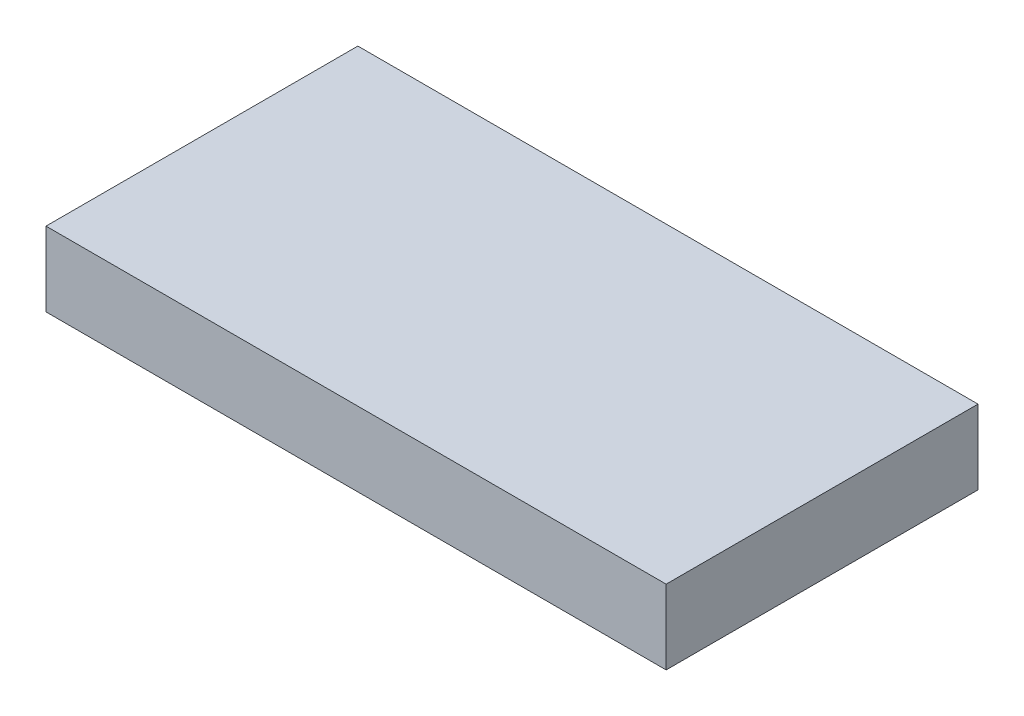
ISO-10303-21;
HEADER;
FILE_DESCRIPTION(('STEP AP214'),'2;1');
FILE_NAME('part.step','',(''),(''),'','','');
FILE_SCHEMA(('AUTOMOTIVE_DESIGN { 1 0 10303 214 1 1 1 1 }'));
ENDSEC;
DATA;
#1=APPLICATION_CONTEXT('core data for automotive mechanical design processes');
#2=APPLICATION_PROTOCOL_DEFINITION('international standard','automotive_design',2000,#1);
#3=PRODUCT_CONTEXT('',#1,'mechanical');
#4=PRODUCT('Part','Part','',(#3));
#5=PRODUCT_RELATED_PRODUCT_CATEGORY('part','',(#4));
#6=PRODUCT_DEFINITION_FORMATION('','',#4);
#7=PRODUCT_DEFINITION_CONTEXT('part definition',#1,'design');
#8=PRODUCT_DEFINITION('design','',#6,#7);
#9=PRODUCT_DEFINITION_SHAPE('','',#8);
#10=(LENGTH_UNIT() NAMED_UNIT(*) SI_UNIT(.MILLI.,.METRE.));
#11=(NAMED_UNIT(*) PLANE_ANGLE_UNIT() SI_UNIT($,.RADIAN.));
#12=(NAMED_UNIT(*) SI_UNIT($,.STERADIAN.) SOLID_ANGLE_UNIT());
#13=UNCERTAINTY_MEASURE_WITH_UNIT(LENGTH_MEASURE(1.E-05),#10,'distance_accuracy_value','');
#14=(GEOMETRIC_REPRESENTATION_CONTEXT(3) GLOBAL_UNCERTAINTY_ASSIGNED_CONTEXT((#13)) GLOBAL_UNIT_ASSIGNED_CONTEXT((#10,
#11,#12)) REPRESENTATION_CONTEXT('',''));
#15=CARTESIAN_POINT('',(0.,0.,0.));
#16=DIRECTION('',(0.,0.,1.));
#17=DIRECTION('',(1.,0.,0.));
#18=AXIS2_PLACEMENT_3D('',#15,#16,#17);
#19=CARTESIAN_POINT('',(39.77,-9.53,20.));
#20=DIRECTION('',(1.,0.,0.));
#21=DIRECTION('',(0.,0.,-1.));
#22=AXIS2_PLACEMENT_3D('',#19,#20,#21);
#23=PLANE('',#22);
#24=DIRECTION('',(0.,0.,-1.));
#25=VECTOR('',#24,1.);
#26=CARTESIAN_POINT('',(39.77,0.,20.));
#27=LINE('',#26,#25);
#28=CARTESIAN_POINT('',(39.77,0.,20.));
#29=VERTEX_POINT('',#28);
#30=CARTESIAN_POINT('',(39.77,0.,-20.));
#31=VERTEX_POINT('',#30);
#32=EDGE_CURVE('E105',#29,#31,#27,.T.);
#33=ORIENTED_EDGE('',*,*,#32,.F.);
#34=DIRECTION('',(0.,1.,0.));
#35=VECTOR('',#34,1.);
#36=CARTESIAN_POINT('',(39.77,-9.53,20.));
#37=LINE('',#36,#35);
#38=CARTESIAN_POINT('',(39.77,-9.53,20.));
#39=VERTEX_POINT('',#38);
#40=EDGE_CURVE('E11',#39,#29,#37,.T.);
#41=ORIENTED_EDGE('',*,*,#40,.F.);
#42=DIRECTION('',(0.,0.,-1.));
#43=VECTOR('',#42,1.);
#44=CARTESIAN_POINT('',(39.77,-9.53,20.));
#45=LINE('',#44,#43);
#46=CARTESIAN_POINT('',(39.77,-9.53,-20.));
#47=VERTEX_POINT('',#46);
#48=EDGE_CURVE('E99',#39,#47,#45,.T.);
#49=ORIENTED_EDGE('',*,*,#48,.T.);
#50=DIRECTION('',(0.,1.,0.));
#51=VECTOR('',#50,1.);
#52=CARTESIAN_POINT('',(39.77,-9.53,-20.));
#53=LINE('',#52,#51);
#54=EDGE_CURVE('E44',#47,#31,#53,.T.);
#55=ORIENTED_EDGE('',*,*,#54,.T.);
#56=EDGE_LOOP('',(#33,#41,#49,#55));
#57=FACE_BOUND('',#56,.T.);
#58=ADVANCED_FACE('F41',(#57),#23,.T.);
#59=CARTESIAN_POINT('',(-39.77,-9.53,20.));
#60=DIRECTION('',(0.,0.,1.));
#61=DIRECTION('',(1.,0.,0.));
#62=AXIS2_PLACEMENT_3D('',#59,#60,#61);
#63=PLANE('',#62);
#64=DIRECTION('',(1.,0.,0.));
#65=VECTOR('',#64,1.);
#66=CARTESIAN_POINT('',(-39.77,0.,20.));
#67=LINE('',#66,#65);
#68=CARTESIAN_POINT('',(-39.77,0.,20.));
#69=VERTEX_POINT('',#68);
#70=EDGE_CURVE('E101',#69,#29,#67,.T.);
#71=ORIENTED_EDGE('',*,*,#70,.F.);
#72=DIRECTION('',(0.,1.,0.));
#73=VECTOR('',#72,1.);
#74=CARTESIAN_POINT('',(-39.77,-9.53,20.));
#75=LINE('',#74,#73);
#76=CARTESIAN_POINT('',(-39.77,-9.53,20.));
#77=VERTEX_POINT('',#76);
#78=EDGE_CURVE('E50',#77,#69,#75,.T.);
#79=ORIENTED_EDGE('',*,*,#78,.F.);
#80=DIRECTION('',(1.,0.,0.));
#81=VECTOR('',#80,1.);
#82=CARTESIAN_POINT('',(-39.77,-9.53,20.));
#83=LINE('',#82,#81);
#84=EDGE_CURVE('E96',#77,#39,#83,.T.);
#85=ORIENTED_EDGE('',*,*,#84,.T.);
#86=ORIENTED_EDGE('',*,*,#40,.T.);
#87=EDGE_LOOP('',(#71,#79,#85,#86));
#88=FACE_BOUND('',#87,.T.);
#89=ADVANCED_FACE('F115',(#88),#63,.T.);
#90=CARTESIAN_POINT('',(-39.77,-9.53,20.));
#91=DIRECTION('',(-1.,0.,0.));
#92=DIRECTION('',(0.,0.,1.));
#93=AXIS2_PLACEMENT_3D('',#90,#91,#92);
#94=PLANE('',#93);
#95=DIRECTION('',(0.,0.,1.));
#96=VECTOR('',#95,1.);
#97=CARTESIAN_POINT('',(-39.77,0.,20.));
#98=LINE('',#97,#96);
#99=CARTESIAN_POINT('',(-39.77,0.,-20.));
#100=VERTEX_POINT('',#99);
#101=EDGE_CURVE('E91',#100,#69,#98,.T.);
#102=ORIENTED_EDGE('',*,*,#101,.F.);
#103=DIRECTION('',(0.,1.,0.));
#104=VECTOR('',#103,1.);
#105=CARTESIAN_POINT('',(-39.77,-9.53,-20.));
#106=LINE('',#105,#104);
#107=CARTESIAN_POINT('',(-39.77,-9.53,-20.));
#108=VERTEX_POINT('',#107);
#109=EDGE_CURVE('E86',#108,#100,#106,.T.);
#110=ORIENTED_EDGE('',*,*,#109,.F.);
#111=DIRECTION('',(0.,0.,1.));
#112=VECTOR('',#111,1.);
#113=CARTESIAN_POINT('',(-39.77,-9.53,20.));
#114=LINE('',#113,#112);
#115=EDGE_CURVE('E89',#108,#77,#114,.T.);
#116=ORIENTED_EDGE('',*,*,#115,.T.);
#117=ORIENTED_EDGE('',*,*,#78,.T.);
#118=EDGE_LOOP('',(#102,#110,#116,#117));
#119=FACE_BOUND('',#118,.T.);
#120=ADVANCED_FACE('F88',(#119),#94,.T.);
#121=CARTESIAN_POINT('',(-39.77,-9.53,-20.));
#122=DIRECTION('',(0.,0.,-1.));
#123=DIRECTION('',(-1.,0.,0.));
#124=AXIS2_PLACEMENT_3D('',#121,#122,#123);
#125=PLANE('',#124);
#126=DIRECTION('',(-1.,0.,0.));
#127=VECTOR('',#126,1.);
#128=CARTESIAN_POINT('',(-39.77,0.,-20.));
#129=LINE('',#128,#127);
#130=EDGE_CURVE('E108',#31,#100,#129,.T.);
#131=ORIENTED_EDGE('',*,*,#130,.F.);
#132=ORIENTED_EDGE('',*,*,#54,.F.);
#133=DIRECTION('',(-1.,0.,0.));
#134=VECTOR('',#133,1.);
#135=CARTESIAN_POINT('',(-39.77,-9.53,-20.));
#136=LINE('',#135,#134);
#137=EDGE_CURVE('E95',#47,#108,#136,.T.);
#138=ORIENTED_EDGE('',*,*,#137,.T.);
#139=ORIENTED_EDGE('',*,*,#109,.T.);
#140=EDGE_LOOP('',(#131,#132,#138,#139));
#141=FACE_BOUND('',#140,.T.);
#142=ADVANCED_FACE('F98',(#141),#125,.T.);
#143=CARTESIAN_POINT('',(0.,-9.53,0.));
#144=DIRECTION('',(0.,-1.,0.));
#145=DIRECTION('',(0.,0.,-1.));
#146=AXIS2_PLACEMENT_3D('',#143,#144,#145);
#147=PLANE('',#146);
#148=ORIENTED_EDGE('',*,*,#48,.F.);
#149=ORIENTED_EDGE('',*,*,#84,.F.);
#150=ORIENTED_EDGE('',*,*,#115,.F.);
#151=ORIENTED_EDGE('',*,*,#137,.F.);
#152=EDGE_LOOP('',(#148,#149,#150,#151));
#153=FACE_BOUND('',#152,.T.);
#154=ADVANCED_FACE('F94',(#153),#147,.T.);
#155=CARTESIAN_POINT('',(0.,0.,0.));
#156=DIRECTION('',(0.,-1.,0.));
#157=DIRECTION('',(0.,0.,-1.));
#158=AXIS2_PLACEMENT_3D('',#155,#156,#157);
#159=PLANE('',#158);
#160=ORIENTED_EDGE('',*,*,#32,.T.);
#161=ORIENTED_EDGE('',*,*,#130,.T.);
#162=ORIENTED_EDGE('',*,*,#101,.T.);
#163=ORIENTED_EDGE('',*,*,#70,.T.);
#164=EDGE_LOOP('',(#160,#161,#162,#163));
#165=FACE_BOUND('',#164,.T.);
#166=ADVANCED_FACE('F114',(#165),#159,.F.);
#167=CLOSED_SHELL('',(#58,#89,#120,#142,#154,#166));
#168=MANIFOLD_SOLID_BREP('B2',#167);
#169=ADVANCED_BREP_SHAPE_REPRESENTATION('',(#18,#168),#14);
#170=SHAPE_DEFINITION_REPRESENTATION(#9,#169);
ENDSEC;
END-ISO-10303-21;
